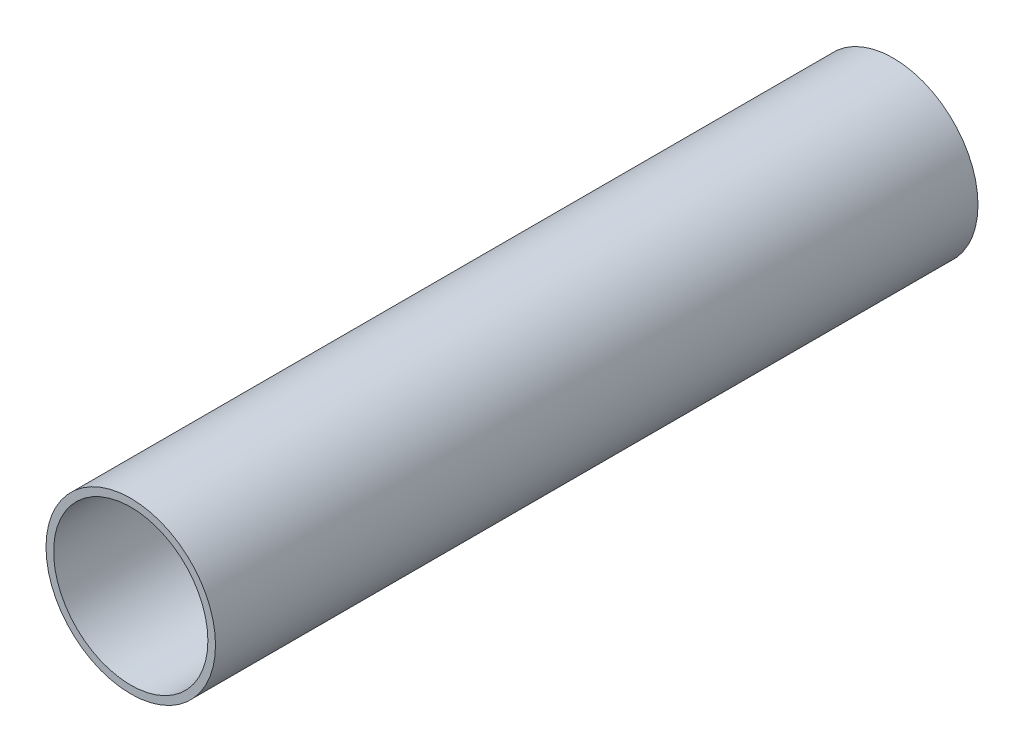
ISO-10303-21;
HEADER;
FILE_DESCRIPTION(('STEP AP214'),'2;1');
FILE_NAME('part.step','',(''),(''),'','','');
FILE_SCHEMA(('AUTOMOTIVE_DESIGN { 1 0 10303 214 1 1 1 1 }'));
ENDSEC;
DATA;
#1=APPLICATION_CONTEXT('core data for automotive mechanical design processes');
#2=APPLICATION_PROTOCOL_DEFINITION('international standard','automotive_design',2000,#1);
#3=PRODUCT_CONTEXT('',#1,'mechanical');
#4=PRODUCT('Part','Part','',(#3));
#5=PRODUCT_RELATED_PRODUCT_CATEGORY('part','',(#4));
#6=PRODUCT_DEFINITION_FORMATION('','',#4);
#7=PRODUCT_DEFINITION_CONTEXT('part definition',#1,'design');
#8=PRODUCT_DEFINITION('design','',#6,#7);
#9=PRODUCT_DEFINITION_SHAPE('','',#8);
#10=(LENGTH_UNIT() NAMED_UNIT(*) SI_UNIT(.MILLI.,.METRE.));
#11=(NAMED_UNIT(*) PLANE_ANGLE_UNIT() SI_UNIT($,.RADIAN.));
#12=(NAMED_UNIT(*) SI_UNIT($,.STERADIAN.) SOLID_ANGLE_UNIT());
#13=UNCERTAINTY_MEASURE_WITH_UNIT(LENGTH_MEASURE(1.E-05),#10,'distance_accuracy_value','');
#14=(GEOMETRIC_REPRESENTATION_CONTEXT(3) GLOBAL_UNCERTAINTY_ASSIGNED_CONTEXT((#13)) GLOBAL_UNIT_ASSIGNED_CONTEXT((#10,
#11,#12)) REPRESENTATION_CONTEXT('',''));
#15=CARTESIAN_POINT('',(0.,0.,0.));
#16=DIRECTION('',(0.,0.,1.));
#17=DIRECTION('',(1.,0.,0.));
#18=AXIS2_PLACEMENT_3D('',#15,#16,#17);
#19=CARTESIAN_POINT('',(0.,0.,200.));
#20=DIRECTION('',(0.,0.,1.));
#21=DIRECTION('',(1.,0.,0.));
#22=AXIS2_PLACEMENT_3D('',#19,#20,#21);
#23=PLANE('',#22);
#24=CARTESIAN_POINT('',(0.,0.,200.));
#25=DIRECTION('',(0.,0.,1.));
#26=DIRECTION('',(1.,0.,0.));
#27=AXIS2_PLACEMENT_3D('',#24,#25,#26);
#28=CIRCLE('',#27,22.23);
#29=CARTESIAN_POINT('',(22.23,0.,200.));
#30=VERTEX_POINT('',#29);
#31=EDGE_CURVE('E10',#30,#30,#28,.T.);
#32=ORIENTED_EDGE('',*,*,#31,.T.);
#33=EDGE_LOOP('',(#32));
#34=FACE_BOUND('',#33,.T.);
#35=CARTESIAN_POINT('',(0.,0.,200.));
#36=DIRECTION('',(0.,0.,1.));
#37=DIRECTION('',(1.,0.,0.));
#38=AXIS2_PLACEMENT_3D('',#35,#36,#37);
#39=CIRCLE('',#38,20.23);
#40=CARTESIAN_POINT('',(20.23,0.,200.));
#41=VERTEX_POINT('',#40);
#42=EDGE_CURVE('E48',#41,#41,#39,.T.);
#43=ORIENTED_EDGE('',*,*,#42,.F.);
#44=EDGE_LOOP('',(#43));
#45=FACE_BOUND('',#44,.T.);
#46=ADVANCED_FACE('F37',(#34,#45),#23,.T.);
#47=CARTESIAN_POINT('',(0.,0.,0.));
#48=DIRECTION('',(0.,0.,1.));
#49=DIRECTION('',(1.,0.,0.));
#50=AXIS2_PLACEMENT_3D('',#47,#48,#49);
#51=PLANE('',#50);
#52=CARTESIAN_POINT('',(0.,0.,0.));
#53=DIRECTION('',(0.,0.,1.));
#54=DIRECTION('',(1.,0.,0.));
#55=AXIS2_PLACEMENT_3D('',#52,#53,#54);
#56=CIRCLE('',#55,22.23);
#57=CARTESIAN_POINT('',(22.23,0.,0.));
#58=VERTEX_POINT('',#57);
#59=EDGE_CURVE('E41',#58,#58,#56,.T.);
#60=ORIENTED_EDGE('',*,*,#59,.F.);
#61=EDGE_LOOP('',(#60));
#62=FACE_BOUND('',#61,.T.);
#63=CARTESIAN_POINT('',(0.,0.,0.));
#64=DIRECTION('',(0.,0.,1.));
#65=DIRECTION('',(1.,0.,0.));
#66=AXIS2_PLACEMENT_3D('',#63,#64,#65);
#67=CIRCLE('',#66,20.23);
#68=CARTESIAN_POINT('',(20.23,0.,0.));
#69=VERTEX_POINT('',#68);
#70=EDGE_CURVE('E50',#69,#69,#67,.T.);
#71=ORIENTED_EDGE('',*,*,#70,.T.);
#72=EDGE_LOOP('',(#71));
#73=FACE_BOUND('',#72,.T.);
#74=ADVANCED_FACE('F60',(#62,#73),#51,.F.);
#75=CARTESIAN_POINT('',(0.,0.,200.));
#76=DIRECTION('',(0.,0.,-1.));
#77=DIRECTION('',(-1.,0.,0.));
#78=AXIS2_PLACEMENT_3D('',#75,#76,#77);
#79=CYLINDRICAL_SURFACE('',#78,22.23);
#80=ORIENTED_EDGE('',*,*,#31,.F.);
#81=EDGE_LOOP('',(#80));
#82=FACE_BOUND('',#81,.T.);
#83=ORIENTED_EDGE('',*,*,#59,.T.);
#84=EDGE_LOOP('',(#83));
#85=FACE_BOUND('',#84,.T.);
#86=ADVANCED_FACE('F39',(#82,#85),#79,.T.);
#87=CARTESIAN_POINT('',(0.,0.,200.));
#88=DIRECTION('',(0.,0.,-1.));
#89=DIRECTION('',(-1.,0.,0.));
#90=AXIS2_PLACEMENT_3D('',#87,#88,#89);
#91=CYLINDRICAL_SURFACE('',#90,20.23);
#92=ORIENTED_EDGE('',*,*,#42,.T.);
#93=EDGE_LOOP('',(#92));
#94=FACE_BOUND('',#93,.T.);
#95=ORIENTED_EDGE('',*,*,#70,.F.);
#96=EDGE_LOOP('',(#95));
#97=FACE_BOUND('',#96,.T.);
#98=ADVANCED_FACE('F56',(#94,#97),#91,.F.);
#99=CLOSED_SHELL('',(#46,#74,#86,#98));
#100=MANIFOLD_SOLID_BREP('B2',#99);
#101=ADVANCED_BREP_SHAPE_REPRESENTATION('',(#18,#100),#14);
#102=SHAPE_DEFINITION_REPRESENTATION(#9,#101);
ENDSEC;
END-ISO-10303-21;
